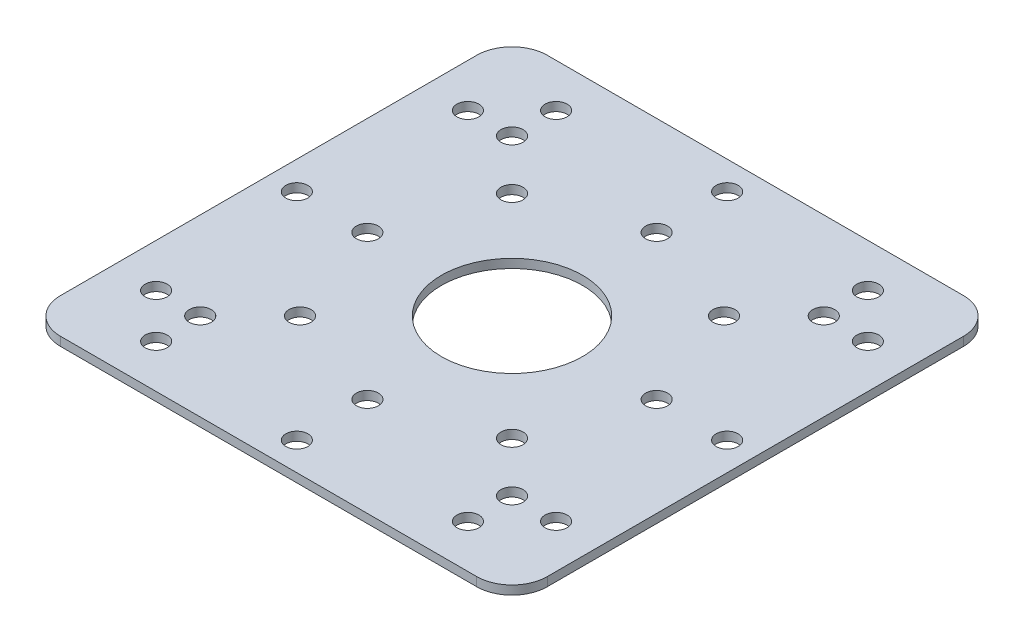
ISO-10303-21;
HEADER;
FILE_DESCRIPTION(('STEP AP214'),'2;1');
FILE_NAME('part.step','',(''),(''),'','','');
FILE_SCHEMA(('AUTOMOTIVE_DESIGN { 1 0 10303 214 1 1 1 1 }'));
ENDSEC;
DATA;
#1=APPLICATION_CONTEXT('core data for automotive mechanical design processes');
#2=APPLICATION_PROTOCOL_DEFINITION('international standard','automotive_design',2000,#1);
#3=PRODUCT_CONTEXT('',#1,'mechanical');
#4=PRODUCT('Part','Part','',(#3));
#5=PRODUCT_RELATED_PRODUCT_CATEGORY('part','',(#4));
#6=PRODUCT_DEFINITION_FORMATION('','',#4);
#7=PRODUCT_DEFINITION_CONTEXT('part definition',#1,'design');
#8=PRODUCT_DEFINITION('design','',#6,#7);
#9=PRODUCT_DEFINITION_SHAPE('','',#8);
#10=(LENGTH_UNIT() NAMED_UNIT(*) SI_UNIT(.MILLI.,.METRE.));
#11=(NAMED_UNIT(*) PLANE_ANGLE_UNIT() SI_UNIT($,.RADIAN.));
#12=(NAMED_UNIT(*) SI_UNIT($,.STERADIAN.) SOLID_ANGLE_UNIT());
#13=UNCERTAINTY_MEASURE_WITH_UNIT(LENGTH_MEASURE(1.E-05),#10,'distance_accuracy_value','');
#14=(GEOMETRIC_REPRESENTATION_CONTEXT(3) GLOBAL_UNCERTAINTY_ASSIGNED_CONTEXT((#13)) GLOBAL_UNIT_ASSIGNED_CONTEXT((#10,
#11,#12)) REPRESENTATION_CONTEXT('',''));
#15=CARTESIAN_POINT('',(0.,0.,0.));
#16=DIRECTION('',(0.,0.,1.));
#17=DIRECTION('',(1.,0.,0.));
#18=AXIS2_PLACEMENT_3D('',#15,#16,#17);
#19=CARTESIAN_POINT('',(-29.972,1.27,29.972));
#20=DIRECTION('',(0.,-1.,0.));
#21=DIRECTION('',(0.,0.,-1.));
#22=AXIS2_PLACEMENT_3D('',#19,#20,#21);
#23=CYLINDRICAL_SURFACE('',#22,5.08);
#24=CARTESIAN_POINT('',(-29.972,0.,29.972));
#25=DIRECTION('',(0.,1.,0.));
#26=DIRECTION('',(0.,0.,1.));
#27=AXIS2_PLACEMENT_3D('',#24,#25,#26);
#28=CIRCLE('',#27,5.08);
#29=CARTESIAN_POINT('',(-35.052,0.,29.972));
#30=VERTEX_POINT('',#29);
#31=CARTESIAN_POINT('',(-29.972,0.,35.052));
#32=VERTEX_POINT('',#31);
#33=EDGE_CURVE('E129',#30,#32,#28,.T.);
#34=ORIENTED_EDGE('',*,*,#33,.T.);
#35=DIRECTION('',(0.,-1.,0.));
#36=VECTOR('',#35,1.);
#37=CARTESIAN_POINT('',(-29.972,1.27,35.052));
#38=LINE('',#37,#36);
#39=CARTESIAN_POINT('',(-29.972,1.27,35.052));
#40=VERTEX_POINT('',#39);
#41=EDGE_CURVE('E11',#40,#32,#38,.T.);
#42=ORIENTED_EDGE('',*,*,#41,.F.);
#43=CARTESIAN_POINT('',(-29.972,1.27,29.972));
#44=DIRECTION('',(0.,1.,0.));
#45=DIRECTION('',(0.,0.,1.));
#46=AXIS2_PLACEMENT_3D('',#43,#44,#45);
#47=CIRCLE('',#46,5.08);
#48=CARTESIAN_POINT('',(-35.052,1.27,29.972));
#49=VERTEX_POINT('',#48);
#50=EDGE_CURVE('E144',#49,#40,#47,.T.);
#51=ORIENTED_EDGE('',*,*,#50,.F.);
#52=DIRECTION('',(0.,-1.,0.));
#53=VECTOR('',#52,1.);
#54=CARTESIAN_POINT('',(-35.052,1.27,29.972));
#55=LINE('',#54,#53);
#56=EDGE_CURVE('E125',#49,#30,#55,.T.);
#57=ORIENTED_EDGE('',*,*,#56,.T.);
#58=EDGE_LOOP('',(#34,#42,#51,#57));
#59=FACE_BOUND('',#58,.T.);
#60=ADVANCED_FACE('F33',(#59),#23,.T.);
#61=CARTESIAN_POINT('',(29.972,1.27,35.052));
#62=DIRECTION('',(0.,0.,-1.));
#63=DIRECTION('',(-1.,0.,0.));
#64=AXIS2_PLACEMENT_3D('',#61,#62,#63);
#65=PLANE('',#64);
#66=DIRECTION('',(1.,0.,0.));
#67=VECTOR('',#66,1.);
#68=CARTESIAN_POINT('',(29.972,0.,35.052));
#69=LINE('',#68,#67);
#70=CARTESIAN_POINT('',(29.972,0.,35.052));
#71=VERTEX_POINT('',#70);
#72=EDGE_CURVE('E132',#32,#71,#69,.T.);
#73=ORIENTED_EDGE('',*,*,#72,.T.);
#74=DIRECTION('',(0.,-1.,0.));
#75=VECTOR('',#74,1.);
#76=CARTESIAN_POINT('',(29.972,1.27,35.052));
#77=LINE('',#76,#75);
#78=CARTESIAN_POINT('',(29.972,1.27,35.052));
#79=VERTEX_POINT('',#78);
#80=EDGE_CURVE('E41',#79,#71,#77,.T.);
#81=ORIENTED_EDGE('',*,*,#80,.F.);
#82=DIRECTION('',(1.,0.,0.));
#83=VECTOR('',#82,1.);
#84=CARTESIAN_POINT('',(29.972,1.27,35.052));
#85=LINE('',#84,#83);
#86=EDGE_CURVE('E92',#40,#79,#85,.T.);
#87=ORIENTED_EDGE('',*,*,#86,.F.);
#88=ORIENTED_EDGE('',*,*,#41,.T.);
#89=EDGE_LOOP('',(#73,#81,#87,#88));
#90=FACE_BOUND('',#89,.T.);
#91=ADVANCED_FACE('F403',(#90),#65,.F.);
#92=CARTESIAN_POINT('',(29.972,1.27,29.972));
#93=DIRECTION('',(0.,-1.,0.));
#94=DIRECTION('',(0.,0.,-1.));
#95=AXIS2_PLACEMENT_3D('',#92,#93,#94);
#96=CYLINDRICAL_SURFACE('',#95,5.08);
#97=CARTESIAN_POINT('',(29.972,0.,29.972));
#98=DIRECTION('',(0.,1.,0.));
#99=DIRECTION('',(0.,0.,1.));
#100=AXIS2_PLACEMENT_3D('',#97,#98,#99);
#101=CIRCLE('',#100,5.08);
#102=CARTESIAN_POINT('',(35.052,0.,29.972));
#103=VERTEX_POINT('',#102);
#104=EDGE_CURVE('E135',#71,#103,#101,.T.);
#105=ORIENTED_EDGE('',*,*,#104,.T.);
#106=DIRECTION('',(0.,-1.,0.));
#107=VECTOR('',#106,1.);
#108=CARTESIAN_POINT('',(35.052,1.27,29.972));
#109=LINE('',#108,#107);
#110=CARTESIAN_POINT('',(35.052,1.27,29.972));
#111=VERTEX_POINT('',#110);
#112=EDGE_CURVE('E151',#111,#103,#109,.T.);
#113=ORIENTED_EDGE('',*,*,#112,.F.);
#114=CARTESIAN_POINT('',(29.972,1.27,29.972));
#115=DIRECTION('',(0.,1.,0.));
#116=DIRECTION('',(0.,0.,1.));
#117=AXIS2_PLACEMENT_3D('',#114,#115,#116);
#118=CIRCLE('',#117,5.08);
#119=EDGE_CURVE('E159',#79,#111,#118,.T.);
#120=ORIENTED_EDGE('',*,*,#119,.F.);
#121=ORIENTED_EDGE('',*,*,#80,.T.);
#122=EDGE_LOOP('',(#105,#113,#120,#121));
#123=FACE_BOUND('',#122,.T.);
#124=ADVANCED_FACE('F157',(#123),#96,.T.);
#125=CARTESIAN_POINT('',(35.052,1.27,29.972));
#126=DIRECTION('',(-1.,0.,0.));
#127=DIRECTION('',(0.,0.,1.));
#128=AXIS2_PLACEMENT_3D('',#125,#126,#127);
#129=PLANE('',#128);
#130=DIRECTION('',(0.,0.,-1.));
#131=VECTOR('',#130,1.);
#132=CARTESIAN_POINT('',(35.052,0.,29.972));
#133=LINE('',#132,#131);
#134=CARTESIAN_POINT('',(35.052,0.,-29.972));
#135=VERTEX_POINT('',#134);
#136=EDGE_CURVE('E137',#103,#135,#133,.T.);
#137=ORIENTED_EDGE('',*,*,#136,.T.);
#138=DIRECTION('',(0.,-1.,0.));
#139=VECTOR('',#138,1.);
#140=CARTESIAN_POINT('',(35.052,1.27,-29.972));
#141=LINE('',#140,#139);
#142=CARTESIAN_POINT('',(35.052,1.27,-29.972));
#143=VERTEX_POINT('',#142);
#144=EDGE_CURVE('E148',#143,#135,#141,.T.);
#145=ORIENTED_EDGE('',*,*,#144,.F.);
#146=DIRECTION('',(0.,0.,-1.));
#147=VECTOR('',#146,1.);
#148=CARTESIAN_POINT('',(35.052,1.27,29.972));
#149=LINE('',#148,#147);
#150=EDGE_CURVE('E171',#111,#143,#149,.T.);
#151=ORIENTED_EDGE('',*,*,#150,.F.);
#152=ORIENTED_EDGE('',*,*,#112,.T.);
#153=EDGE_LOOP('',(#137,#145,#151,#152));
#154=FACE_BOUND('',#153,.T.);
#155=ADVANCED_FACE('F167',(#154),#129,.F.);
#156=CARTESIAN_POINT('',(29.972,1.27,-29.972));
#157=DIRECTION('',(0.,-1.,0.));
#158=DIRECTION('',(0.,0.,-1.));
#159=AXIS2_PLACEMENT_3D('',#156,#157,#158);
#160=CYLINDRICAL_SURFACE('',#159,5.08);
#161=CARTESIAN_POINT('',(29.972,0.,-29.972));
#162=DIRECTION('',(0.,1.,0.));
#163=DIRECTION('',(0.,0.,1.));
#164=AXIS2_PLACEMENT_3D('',#161,#162,#163);
#165=CIRCLE('',#164,5.08);
#166=CARTESIAN_POINT('',(29.972,0.,-35.052));
#167=VERTEX_POINT('',#166);
#168=EDGE_CURVE('E139',#135,#167,#165,.T.);
#169=ORIENTED_EDGE('',*,*,#168,.T.);
#170=DIRECTION('',(0.,-1.,0.));
#171=VECTOR('',#170,1.);
#172=CARTESIAN_POINT('',(29.972,1.27,-35.052));
#173=LINE('',#172,#171);
#174=CARTESIAN_POINT('',(29.972,1.27,-35.052));
#175=VERTEX_POINT('',#174);
#176=EDGE_CURVE('E120',#175,#167,#173,.T.);
#177=ORIENTED_EDGE('',*,*,#176,.F.);
#178=CARTESIAN_POINT('',(29.972,1.27,-29.972));
#179=DIRECTION('',(0.,1.,0.));
#180=DIRECTION('',(0.,0.,1.));
#181=AXIS2_PLACEMENT_3D('',#178,#179,#180);
#182=CIRCLE('',#181,5.08);
#183=EDGE_CURVE('E111',#143,#175,#182,.T.);
#184=ORIENTED_EDGE('',*,*,#183,.F.);
#185=ORIENTED_EDGE('',*,*,#144,.T.);
#186=EDGE_LOOP('',(#169,#177,#184,#185));
#187=FACE_BOUND('',#186,.T.);
#188=ADVANCED_FACE('F170',(#187),#160,.T.);
#189=CARTESIAN_POINT('',(29.972,1.27,-35.052));
#190=DIRECTION('',(0.,0.,1.));
#191=DIRECTION('',(1.,0.,0.));
#192=AXIS2_PLACEMENT_3D('',#189,#190,#191);
#193=PLANE('',#192);
#194=DIRECTION('',(-1.,0.,0.));
#195=VECTOR('',#194,1.);
#196=CARTESIAN_POINT('',(29.972,0.,-35.052));
#197=LINE('',#196,#195);
#198=CARTESIAN_POINT('',(-29.972,0.,-35.052));
#199=VERTEX_POINT('',#198);
#200=EDGE_CURVE('E119',#167,#199,#197,.T.);
#201=ORIENTED_EDGE('',*,*,#200,.T.);
#202=DIRECTION('',(0.,-1.,0.));
#203=VECTOR('',#202,1.);
#204=CARTESIAN_POINT('',(-29.972,1.27,-35.052));
#205=LINE('',#204,#203);
#206=CARTESIAN_POINT('',(-29.972,1.27,-35.052));
#207=VERTEX_POINT('',#206);
#208=EDGE_CURVE('E116',#207,#199,#205,.T.);
#209=ORIENTED_EDGE('',*,*,#208,.F.);
#210=DIRECTION('',(-1.,0.,0.));
#211=VECTOR('',#210,1.);
#212=CARTESIAN_POINT('',(29.972,1.27,-35.052));
#213=LINE('',#212,#211);
#214=EDGE_CURVE('E105',#175,#207,#213,.T.);
#215=ORIENTED_EDGE('',*,*,#214,.F.);
#216=ORIENTED_EDGE('',*,*,#176,.T.);
#217=EDGE_LOOP('',(#201,#209,#215,#216));
#218=FACE_BOUND('',#217,.T.);
#219=ADVANCED_FACE('F117',(#218),#193,.F.);
#220=CARTESIAN_POINT('',(-29.972,1.27,-29.972));
#221=DIRECTION('',(0.,-1.,0.));
#222=DIRECTION('',(0.,0.,-1.));
#223=AXIS2_PLACEMENT_3D('',#220,#221,#222);
#224=CYLINDRICAL_SURFACE('',#223,5.08);
#225=CARTESIAN_POINT('',(-29.972,0.,-29.972));
#226=DIRECTION('',(0.,1.,0.));
#227=DIRECTION('',(0.,0.,1.));
#228=AXIS2_PLACEMENT_3D('',#225,#226,#227);
#229=CIRCLE('',#228,5.08);
#230=CARTESIAN_POINT('',(-35.052,0.,-29.972));
#231=VERTEX_POINT('',#230);
#232=EDGE_CURVE('E78',#199,#231,#229,.T.);
#233=ORIENTED_EDGE('',*,*,#232,.T.);
#234=DIRECTION('',(0.,-1.,0.));
#235=VECTOR('',#234,1.);
#236=CARTESIAN_POINT('',(-35.052,1.27,-29.972));
#237=LINE('',#236,#235);
#238=CARTESIAN_POINT('',(-35.052,1.27,-29.972));
#239=VERTEX_POINT('',#238);
#240=EDGE_CURVE('E121',#239,#231,#237,.T.);
#241=ORIENTED_EDGE('',*,*,#240,.F.);
#242=CARTESIAN_POINT('',(-29.972,1.27,-29.972));
#243=DIRECTION('',(0.,1.,0.));
#244=DIRECTION('',(0.,0.,1.));
#245=AXIS2_PLACEMENT_3D('',#242,#243,#244);
#246=CIRCLE('',#245,5.08);
#247=EDGE_CURVE('E109',#207,#239,#246,.T.);
#248=ORIENTED_EDGE('',*,*,#247,.F.);
#249=ORIENTED_EDGE('',*,*,#208,.T.);
#250=EDGE_LOOP('',(#233,#241,#248,#249));
#251=FACE_BOUND('',#250,.T.);
#252=ADVANCED_FACE('F123',(#251),#224,.T.);
#253=CARTESIAN_POINT('',(-35.052,1.27,29.972));
#254=DIRECTION('',(1.,0.,0.));
#255=DIRECTION('',(0.,0.,-1.));
#256=AXIS2_PLACEMENT_3D('',#253,#254,#255);
#257=PLANE('',#256);
#258=DIRECTION('',(0.,0.,1.));
#259=VECTOR('',#258,1.);
#260=CARTESIAN_POINT('',(-35.052,0.,29.972));
#261=LINE('',#260,#259);
#262=EDGE_CURVE('E84',#231,#30,#261,.T.);
#263=ORIENTED_EDGE('',*,*,#262,.T.);
#264=ORIENTED_EDGE('',*,*,#56,.F.);
#265=DIRECTION('',(0.,0.,1.));
#266=VECTOR('',#265,1.);
#267=CARTESIAN_POINT('',(-35.052,1.27,29.972));
#268=LINE('',#267,#266);
#269=EDGE_CURVE('E49',#239,#49,#268,.T.);
#270=ORIENTED_EDGE('',*,*,#269,.F.);
#271=ORIENTED_EDGE('',*,*,#240,.T.);
#272=EDGE_LOOP('',(#263,#264,#270,#271));
#273=FACE_BOUND('',#272,.T.);
#274=ADVANCED_FACE('F338',(#273),#257,.F.);
#275=CARTESIAN_POINT('',(-29.972,1.27,29.972));
#276=DIRECTION('',(0.,1.,0.));
#277=DIRECTION('',(0.,0.,1.));
#278=AXIS2_PLACEMENT_3D('',#275,#276,#277);
#279=PLANE('',#278);
#280=CARTESIAN_POINT('',(-22.4506403026729,1.27,-22.4506403026729));
#281=DIRECTION('',(0.,1.,0.));
#282=DIRECTION('',(0.,0.,-1.));
#283=AXIS2_PLACEMENT_3D('',#280,#281,#282);
#284=CIRCLE('',#283,1.5875);
#285=CARTESIAN_POINT('',(-22.4506403026729,1.27,-24.0381403026729));
#286=VERTEX_POINT('',#285);
#287=EDGE_CURVE('E321',#286,#286,#284,.T.);
#288=ORIENTED_EDGE('',*,*,#287,.F.);
#289=EDGE_LOOP('',(#288));
#290=FACE_BOUND('',#289,.T.);
#291=CARTESIAN_POINT('',(-15.2664354058176,1.27,-15.2664354058176));
#292=DIRECTION('',(0.,1.,0.));
#293=DIRECTION('',(0.,0.,-1.));
#294=AXIS2_PLACEMENT_3D('',#291,#292,#293);
#295=CIRCLE('',#294,1.5875);
#296=CARTESIAN_POINT('',(-15.2664354058176,1.27,-16.8539354058176));
#297=VERTEX_POINT('',#296);
#298=EDGE_CURVE('E315',#297,#297,#295,.T.);
#299=ORIENTED_EDGE('',*,*,#298,.F.);
#300=EDGE_LOOP('',(#299));
#301=FACE_BOUND('',#300,.T.);
#302=CARTESIAN_POINT('',(-28.8006403026729,1.27,-22.4506403026729));
#303=DIRECTION('',(0.,1.,0.));
#304=DIRECTION('',(0.,0.,-1.));
#305=AXIS2_PLACEMENT_3D('',#302,#303,#304);
#306=CIRCLE('',#305,1.5875);
#307=CARTESIAN_POINT('',(-28.8006403026729,1.27,-24.0381403026729));
#308=VERTEX_POINT('',#307);
#309=EDGE_CURVE('E309',#308,#308,#306,.T.);
#310=ORIENTED_EDGE('',*,*,#309,.F.);
#311=EDGE_LOOP('',(#310));
#312=FACE_BOUND('',#311,.T.);
#313=CARTESIAN_POINT('',(-22.4506403026729,1.27,-28.8006403026729));
#314=DIRECTION('',(0.,1.,0.));
#315=DIRECTION('',(0.,0.,-1.));
#316=AXIS2_PLACEMENT_3D('',#313,#314,#315);
#317=CIRCLE('',#316,1.5875);
#318=CARTESIAN_POINT('',(-22.4506403026729,1.27,-30.3881403026729));
#319=VERTEX_POINT('',#318);
#320=EDGE_CURVE('E303',#319,#319,#317,.T.);
#321=ORIENTED_EDGE('',*,*,#320,.F.);
#322=EDGE_LOOP('',(#321));
#323=FACE_BOUND('',#322,.T.);
#324=CARTESIAN_POINT('',(15.2664354058175,1.27,-15.2664354058176));
#325=DIRECTION('',(0.,1.,0.));
#326=DIRECTION('',(0.,0.,1.));
#327=AXIS2_PLACEMENT_3D('',#324,#325,#326);
#328=CIRCLE('',#327,1.5875);
#329=CARTESIAN_POINT('',(15.2664354058175,1.27,-13.6789354058176));
#330=VERTEX_POINT('',#329);
#331=EDGE_CURVE('E297',#330,#330,#328,.T.);
#332=ORIENTED_EDGE('',*,*,#331,.F.);
#333=EDGE_LOOP('',(#332));
#334=FACE_BOUND('',#333,.T.);
#335=CARTESIAN_POINT('',(22.4506403026729,1.27,-22.4506403026729));
#336=DIRECTION('',(0.,1.,0.));
#337=DIRECTION('',(0.,0.,1.));
#338=AXIS2_PLACEMENT_3D('',#335,#336,#337);
#339=CIRCLE('',#338,1.5875);
#340=CARTESIAN_POINT('',(22.4506403026729,1.27,-20.8631403026729));
#341=VERTEX_POINT('',#340);
#342=EDGE_CURVE('E291',#341,#341,#339,.T.);
#343=ORIENTED_EDGE('',*,*,#342,.F.);
#344=EDGE_LOOP('',(#343));
#345=FACE_BOUND('',#344,.T.);
#346=CARTESIAN_POINT('',(22.4506403026729,1.27,-28.8006403026729));
#347=DIRECTION('',(0.,1.,0.));
#348=DIRECTION('',(0.,0.,1.));
#349=AXIS2_PLACEMENT_3D('',#346,#347,#348);
#350=CIRCLE('',#349,1.5875);
#351=CARTESIAN_POINT('',(22.4506403026729,1.27,-27.2131403026729));
#352=VERTEX_POINT('',#351);
#353=EDGE_CURVE('E285',#352,#352,#350,.T.);
#354=ORIENTED_EDGE('',*,*,#353,.F.);
#355=EDGE_LOOP('',(#354));
#356=FACE_BOUND('',#355,.T.);
#357=CARTESIAN_POINT('',(28.8006403026729,1.27,-22.4506403026729));
#358=DIRECTION('',(0.,1.,0.));
#359=DIRECTION('',(0.,0.,1.));
#360=AXIS2_PLACEMENT_3D('',#357,#358,#359);
#361=CIRCLE('',#360,1.5875);
#362=CARTESIAN_POINT('',(28.8006403026729,1.27,-20.8631403026729));
#363=VERTEX_POINT('',#362);
#364=EDGE_CURVE('E279',#363,#363,#361,.T.);
#365=ORIENTED_EDGE('',*,*,#364,.F.);
#366=EDGE_LOOP('',(#365));
#367=FACE_BOUND('',#366,.T.);
#368=CARTESIAN_POINT('',(15.2664354058175,1.27,15.2664354058176));
#369=DIRECTION('',(0.,1.,0.));
#370=DIRECTION('',(0.,0.,-1.));
#371=AXIS2_PLACEMENT_3D('',#368,#369,#370);
#372=CIRCLE('',#371,1.5875);
#373=CARTESIAN_POINT('',(15.2664354058175,1.27,13.6789354058176));
#374=VERTEX_POINT('',#373);
#375=EDGE_CURVE('E273',#374,#374,#372,.T.);
#376=ORIENTED_EDGE('',*,*,#375,.F.);
#377=EDGE_LOOP('',(#376));
#378=FACE_BOUND('',#377,.T.);
#379=CARTESIAN_POINT('',(22.4506403026729,1.27,22.4506403026729));
#380=DIRECTION('',(0.,1.,0.));
#381=DIRECTION('',(0.,0.,-1.));
#382=AXIS2_PLACEMENT_3D('',#379,#380,#381);
#383=CIRCLE('',#382,1.5875);
#384=CARTESIAN_POINT('',(22.4506403026729,1.27,20.8631403026729));
#385=VERTEX_POINT('',#384);
#386=EDGE_CURVE('E267',#385,#385,#383,.T.);
#387=ORIENTED_EDGE('',*,*,#386,.F.);
#388=EDGE_LOOP('',(#387));
#389=FACE_BOUND('',#388,.T.);
#390=CARTESIAN_POINT('',(22.4506403026729,1.27,28.8006403026729));
#391=DIRECTION('',(0.,1.,0.));
#392=DIRECTION('',(0.,0.,-1.));
#393=AXIS2_PLACEMENT_3D('',#390,#391,#392);
#394=CIRCLE('',#393,1.5875);
#395=CARTESIAN_POINT('',(22.4506403026729,1.27,27.2131403026729));
#396=VERTEX_POINT('',#395);
#397=EDGE_CURVE('E261',#396,#396,#394,.T.);
#398=ORIENTED_EDGE('',*,*,#397,.F.);
#399=EDGE_LOOP('',(#398));
#400=FACE_BOUND('',#399,.T.);
#401=CARTESIAN_POINT('',(28.8006403026729,1.27,22.4506403026729));
#402=DIRECTION('',(0.,1.,0.));
#403=DIRECTION('',(0.,0.,-1.));
#404=AXIS2_PLACEMENT_3D('',#401,#402,#403);
#405=CIRCLE('',#404,1.5875);
#406=CARTESIAN_POINT('',(28.8006403026729,1.27,20.8631403026729));
#407=VERTEX_POINT('',#406);
#408=EDGE_CURVE('E255',#407,#407,#405,.T.);
#409=ORIENTED_EDGE('',*,*,#408,.F.);
#410=EDGE_LOOP('',(#409));
#411=FACE_BOUND('',#410,.T.);
#412=CARTESIAN_POINT('',(-22.4506403026729,1.27,28.8006403026729));
#413=DIRECTION('',(0.,1.,0.));
#414=DIRECTION('',(0.,0.,1.));
#415=AXIS2_PLACEMENT_3D('',#412,#413,#414);
#416=CIRCLE('',#415,1.5875);
#417=CARTESIAN_POINT('',(-22.4506403026729,1.27,30.3881403026729));
#418=VERTEX_POINT('',#417);
#419=EDGE_CURVE('E249',#418,#418,#416,.T.);
#420=ORIENTED_EDGE('',*,*,#419,.F.);
#421=EDGE_LOOP('',(#420));
#422=FACE_BOUND('',#421,.T.);
#423=CARTESIAN_POINT('',(-28.8006403026729,1.27,22.4506403026729));
#424=DIRECTION('',(0.,1.,0.));
#425=DIRECTION('',(0.,0.,1.));
#426=AXIS2_PLACEMENT_3D('',#423,#424,#425);
#427=CIRCLE('',#426,1.5875);
#428=CARTESIAN_POINT('',(-28.8006403026729,1.27,24.0381403026729));
#429=VERTEX_POINT('',#428);
#430=EDGE_CURVE('E243',#429,#429,#427,.T.);
#431=ORIENTED_EDGE('',*,*,#430,.F.);
#432=EDGE_LOOP('',(#431));
#433=FACE_BOUND('',#432,.T.);
#434=CARTESIAN_POINT('',(-22.4506403026729,1.27,22.4506403026729));
#435=DIRECTION('',(0.,1.,0.));
#436=DIRECTION('',(0.,0.,1.));
#437=AXIS2_PLACEMENT_3D('',#434,#435,#436);
#438=CIRCLE('',#437,1.5875);
#439=CARTESIAN_POINT('',(-22.4506403026729,1.27,24.0381403026729));
#440=VERTEX_POINT('',#439);
#441=EDGE_CURVE('E237',#440,#440,#438,.T.);
#442=ORIENTED_EDGE('',*,*,#441,.F.);
#443=EDGE_LOOP('',(#442));
#444=FACE_BOUND('',#443,.T.);
#445=CARTESIAN_POINT('',(-15.2664354058176,1.27,15.2664354058176));
#446=DIRECTION('',(0.,1.,0.));
#447=DIRECTION('',(0.,0.,1.));
#448=AXIS2_PLACEMENT_3D('',#445,#446,#447);
#449=CIRCLE('',#448,1.5875);
#450=CARTESIAN_POINT('',(-15.2664354058176,1.27,16.8539354058176));
#451=VERTEX_POINT('',#450);
#452=EDGE_CURVE('E231',#451,#451,#449,.T.);
#453=ORIENTED_EDGE('',*,*,#452,.F.);
#454=EDGE_LOOP('',(#453));
#455=FACE_BOUND('',#454,.T.);
#456=CARTESIAN_POINT('',(0.,1.27,-20.828));
#457=DIRECTION('',(0.,1.,0.));
#458=DIRECTION('',(0.,0.,-1.));
#459=AXIS2_PLACEMENT_3D('',#456,#457,#458);
#460=CIRCLE('',#459,1.5875);
#461=CARTESIAN_POINT('',(0.,1.27,-22.4155));
#462=VERTEX_POINT('',#461);
#463=EDGE_CURVE('E225',#462,#462,#460,.T.);
#464=ORIENTED_EDGE('',*,*,#463,.F.);
#465=EDGE_LOOP('',(#464));
#466=FACE_BOUND('',#465,.T.);
#467=CARTESIAN_POINT('',(6.07938570672835E-13,1.27,-30.988));
#468=DIRECTION('',(0.,1.,0.));
#469=DIRECTION('',(0.,0.,-1.));
#470=AXIS2_PLACEMENT_3D('',#467,#468,#469);
#471=CIRCLE('',#470,1.5875);
#472=CARTESIAN_POINT('',(6.07938570672835E-13,1.27,-32.5755));
#473=VERTEX_POINT('',#472);
#474=EDGE_CURVE('E219',#473,#473,#471,.T.);
#475=ORIENTED_EDGE('',*,*,#474,.F.);
#476=EDGE_LOOP('',(#475));
#477=FACE_BOUND('',#476,.T.);
#478=CARTESIAN_POINT('',(-30.988,1.27,0.));
#479=DIRECTION('',(0.,1.,0.));
#480=DIRECTION('',(0.,0.,-1.));
#481=AXIS2_PLACEMENT_3D('',#478,#479,#480);
#482=CIRCLE('',#481,1.5875);
#483=CARTESIAN_POINT('',(-30.988,1.27,-1.58750000000002));
#484=VERTEX_POINT('',#483);
#485=EDGE_CURVE('E213',#484,#484,#482,.T.);
#486=ORIENTED_EDGE('',*,*,#485,.F.);
#487=EDGE_LOOP('',(#486));
#488=FACE_BOUND('',#487,.T.);
#489=CARTESIAN_POINT('',(-20.8337921886678,1.27,0.));
#490=DIRECTION('',(0.,1.,0.));
#491=DIRECTION('',(0.,0.,-1.));
#492=AXIS2_PLACEMENT_3D('',#489,#490,#491);
#493=CIRCLE('',#492,1.5875);
#494=CARTESIAN_POINT('',(-20.8337921886678,1.27,-1.58750000000002));
#495=VERTEX_POINT('',#494);
#496=EDGE_CURVE('E207',#495,#495,#493,.T.);
#497=ORIENTED_EDGE('',*,*,#496,.F.);
#498=EDGE_LOOP('',(#497));
#499=FACE_BOUND('',#498,.T.);
#500=CARTESIAN_POINT('',(5.65519853168439E-13,1.27,30.988));
#501=DIRECTION('',(0.,1.,0.));
#502=DIRECTION('',(0.,0.,1.));
#503=AXIS2_PLACEMENT_3D('',#500,#501,#502);
#504=CIRCLE('',#503,1.5875);
#505=CARTESIAN_POINT('',(5.65519853168439E-13,1.27,32.5755));
#506=VERTEX_POINT('',#505);
#507=EDGE_CURVE('E201',#506,#506,#504,.T.);
#508=ORIENTED_EDGE('',*,*,#507,.F.);
#509=EDGE_LOOP('',(#508));
#510=FACE_BOUND('',#509,.T.);
#511=CARTESIAN_POINT('',(30.988,1.27,0.));
#512=DIRECTION('',(0.,1.,0.));
#513=DIRECTION('',(0.,0.,1.));
#514=AXIS2_PLACEMENT_3D('',#511,#512,#513);
#515=CIRCLE('',#514,1.5875);
#516=CARTESIAN_POINT('',(30.988,1.27,1.5875));
#517=VERTEX_POINT('',#516);
#518=EDGE_CURVE('E195',#517,#517,#515,.T.);
#519=ORIENTED_EDGE('',*,*,#518,.F.);
#520=EDGE_LOOP('',(#519));
#521=FACE_BOUND('',#520,.T.);
#522=CARTESIAN_POINT('',(0.,1.27,20.828));
#523=DIRECTION('',(0.,1.,0.));
#524=DIRECTION('',(0.,0.,1.));
#525=AXIS2_PLACEMENT_3D('',#522,#523,#524);
#526=CIRCLE('',#525,1.5875);
#527=CARTESIAN_POINT('',(0.,1.27,22.4155));
#528=VERTEX_POINT('',#527);
#529=EDGE_CURVE('E189',#528,#528,#526,.T.);
#530=ORIENTED_EDGE('',*,*,#529,.F.);
#531=EDGE_LOOP('',(#530));
#532=FACE_BOUND('',#531,.T.);
#533=CARTESIAN_POINT('',(20.8337921886678,1.27,0.));
#534=DIRECTION('',(0.,1.,0.));
#535=DIRECTION('',(0.,0.,1.));
#536=AXIS2_PLACEMENT_3D('',#533,#534,#535);
#537=CIRCLE('',#536,1.5875);
#538=CARTESIAN_POINT('',(20.8337921886678,1.27,1.5875));
#539=VERTEX_POINT('',#538);
#540=EDGE_CURVE('E183',#539,#539,#537,.T.);
#541=ORIENTED_EDGE('',*,*,#540,.F.);
#542=EDGE_LOOP('',(#541));
#543=FACE_BOUND('',#542,.T.);
#544=CARTESIAN_POINT('',(0.,1.27,0.));
#545=DIRECTION('',(0.,1.,0.));
#546=DIRECTION('',(0.,0.,1.));
#547=AXIS2_PLACEMENT_3D('',#544,#545,#546);
#548=CIRCLE('',#547,10.16);
#549=CARTESIAN_POINT('',(0.,1.27,10.16));
#550=VERTEX_POINT('',#549);
#551=EDGE_CURVE('E177',#550,#550,#548,.T.);
#552=ORIENTED_EDGE('',*,*,#551,.F.);
#553=EDGE_LOOP('',(#552));
#554=FACE_BOUND('',#553,.T.);
#555=ORIENTED_EDGE('',*,*,#50,.T.);
#556=ORIENTED_EDGE('',*,*,#86,.T.);
#557=ORIENTED_EDGE('',*,*,#119,.T.);
#558=ORIENTED_EDGE('',*,*,#150,.T.);
#559=ORIENTED_EDGE('',*,*,#183,.T.);
#560=ORIENTED_EDGE('',*,*,#214,.T.);
#561=ORIENTED_EDGE('',*,*,#247,.T.);
#562=ORIENTED_EDGE('',*,*,#269,.T.);
#563=EDGE_LOOP('',(#555,#556,#557,#558,#559,#560,#561,#562));
#564=FACE_BOUND('',#563,.T.);
#565=ADVANCED_FACE('F107',(#290,#301,#312,#323,#334,#345,#356,#367,#378,#389,#400,#411,#422,
#433,#444,#455,#466,#477,#488,#499,#510,#521,#532,#543,#554,#564),#279,.T.);
#566=CARTESIAN_POINT('',(-29.972,0.,29.972));
#567=DIRECTION('',(0.,1.,0.));
#568=DIRECTION('',(0.,0.,1.));
#569=AXIS2_PLACEMENT_3D('',#566,#567,#568);
#570=PLANE('',#569);
#571=CARTESIAN_POINT('',(-22.4506403026729,0.,-22.4506403026729));
#572=DIRECTION('',(0.,1.,0.));
#573=DIRECTION('',(0.,0.,-1.));
#574=AXIS2_PLACEMENT_3D('',#571,#572,#573);
#575=CIRCLE('',#574,1.5875);
#576=CARTESIAN_POINT('',(-22.4506403026729,0.,-24.0381403026729));
#577=VERTEX_POINT('',#576);
#578=EDGE_CURVE('E318',#577,#577,#575,.T.);
#579=ORIENTED_EDGE('',*,*,#578,.T.);
#580=EDGE_LOOP('',(#579));
#581=FACE_BOUND('',#580,.T.);
#582=CARTESIAN_POINT('',(-15.2664354058176,0.,-15.2664354058176));
#583=DIRECTION('',(0.,1.,0.));
#584=DIRECTION('',(0.,0.,-1.));
#585=AXIS2_PLACEMENT_3D('',#582,#583,#584);
#586=CIRCLE('',#585,1.5875);
#587=CARTESIAN_POINT('',(-15.2664354058176,0.,-16.8539354058176));
#588=VERTEX_POINT('',#587);
#589=EDGE_CURVE('E312',#588,#588,#586,.T.);
#590=ORIENTED_EDGE('',*,*,#589,.T.);
#591=EDGE_LOOP('',(#590));
#592=FACE_BOUND('',#591,.T.);
#593=CARTESIAN_POINT('',(-28.8006403026729,0.,-22.4506403026729));
#594=DIRECTION('',(0.,1.,0.));
#595=DIRECTION('',(0.,0.,-1.));
#596=AXIS2_PLACEMENT_3D('',#593,#594,#595);
#597=CIRCLE('',#596,1.5875);
#598=CARTESIAN_POINT('',(-28.8006403026729,0.,-24.0381403026729));
#599=VERTEX_POINT('',#598);
#600=EDGE_CURVE('E306',#599,#599,#597,.T.);
#601=ORIENTED_EDGE('',*,*,#600,.T.);
#602=EDGE_LOOP('',(#601));
#603=FACE_BOUND('',#602,.T.);
#604=CARTESIAN_POINT('',(-22.4506403026729,0.,-28.8006403026729));
#605=DIRECTION('',(0.,1.,0.));
#606=DIRECTION('',(0.,0.,-1.));
#607=AXIS2_PLACEMENT_3D('',#604,#605,#606);
#608=CIRCLE('',#607,1.5875);
#609=CARTESIAN_POINT('',(-22.4506403026729,0.,-30.3881403026729));
#610=VERTEX_POINT('',#609);
#611=EDGE_CURVE('E300',#610,#610,#608,.T.);
#612=ORIENTED_EDGE('',*,*,#611,.T.);
#613=EDGE_LOOP('',(#612));
#614=FACE_BOUND('',#613,.T.);
#615=CARTESIAN_POINT('',(15.2664354058175,0.,-15.2664354058176));
#616=DIRECTION('',(0.,1.,0.));
#617=DIRECTION('',(0.,0.,1.));
#618=AXIS2_PLACEMENT_3D('',#615,#616,#617);
#619=CIRCLE('',#618,1.5875);
#620=CARTESIAN_POINT('',(15.2664354058175,0.,-13.6789354058176));
#621=VERTEX_POINT('',#620);
#622=EDGE_CURVE('E294',#621,#621,#619,.T.);
#623=ORIENTED_EDGE('',*,*,#622,.T.);
#624=EDGE_LOOP('',(#623));
#625=FACE_BOUND('',#624,.T.);
#626=CARTESIAN_POINT('',(22.4506403026729,0.,-22.4506403026729));
#627=DIRECTION('',(0.,1.,0.));
#628=DIRECTION('',(0.,0.,1.));
#629=AXIS2_PLACEMENT_3D('',#626,#627,#628);
#630=CIRCLE('',#629,1.5875);
#631=CARTESIAN_POINT('',(22.4506403026729,0.,-20.8631403026729));
#632=VERTEX_POINT('',#631);
#633=EDGE_CURVE('E288',#632,#632,#630,.T.);
#634=ORIENTED_EDGE('',*,*,#633,.T.);
#635=EDGE_LOOP('',(#634));
#636=FACE_BOUND('',#635,.T.);
#637=CARTESIAN_POINT('',(22.4506403026729,0.,-28.8006403026729));
#638=DIRECTION('',(0.,1.,0.));
#639=DIRECTION('',(0.,0.,1.));
#640=AXIS2_PLACEMENT_3D('',#637,#638,#639);
#641=CIRCLE('',#640,1.5875);
#642=CARTESIAN_POINT('',(22.4506403026729,0.,-27.2131403026729));
#643=VERTEX_POINT('',#642);
#644=EDGE_CURVE('E282',#643,#643,#641,.T.);
#645=ORIENTED_EDGE('',*,*,#644,.T.);
#646=EDGE_LOOP('',(#645));
#647=FACE_BOUND('',#646,.T.);
#648=CARTESIAN_POINT('',(28.8006403026729,0.,-22.4506403026729));
#649=DIRECTION('',(0.,1.,0.));
#650=DIRECTION('',(0.,0.,1.));
#651=AXIS2_PLACEMENT_3D('',#648,#649,#650);
#652=CIRCLE('',#651,1.5875);
#653=CARTESIAN_POINT('',(28.8006403026729,0.,-20.8631403026729));
#654=VERTEX_POINT('',#653);
#655=EDGE_CURVE('E276',#654,#654,#652,.T.);
#656=ORIENTED_EDGE('',*,*,#655,.T.);
#657=EDGE_LOOP('',(#656));
#658=FACE_BOUND('',#657,.T.);
#659=CARTESIAN_POINT('',(15.2664354058175,0.,15.2664354058176));
#660=DIRECTION('',(0.,1.,0.));
#661=DIRECTION('',(0.,0.,-1.));
#662=AXIS2_PLACEMENT_3D('',#659,#660,#661);
#663=CIRCLE('',#662,1.5875);
#664=CARTESIAN_POINT('',(15.2664354058175,0.,13.6789354058176));
#665=VERTEX_POINT('',#664);
#666=EDGE_CURVE('E270',#665,#665,#663,.T.);
#667=ORIENTED_EDGE('',*,*,#666,.T.);
#668=EDGE_LOOP('',(#667));
#669=FACE_BOUND('',#668,.T.);
#670=CARTESIAN_POINT('',(22.4506403026729,0.,22.4506403026729));
#671=DIRECTION('',(0.,1.,0.));
#672=DIRECTION('',(0.,0.,-1.));
#673=AXIS2_PLACEMENT_3D('',#670,#671,#672);
#674=CIRCLE('',#673,1.5875);
#675=CARTESIAN_POINT('',(22.4506403026729,0.,20.8631403026729));
#676=VERTEX_POINT('',#675);
#677=EDGE_CURVE('E264',#676,#676,#674,.T.);
#678=ORIENTED_EDGE('',*,*,#677,.T.);
#679=EDGE_LOOP('',(#678));
#680=FACE_BOUND('',#679,.T.);
#681=CARTESIAN_POINT('',(22.4506403026729,0.,28.8006403026729));
#682=DIRECTION('',(0.,1.,0.));
#683=DIRECTION('',(0.,0.,-1.));
#684=AXIS2_PLACEMENT_3D('',#681,#682,#683);
#685=CIRCLE('',#684,1.5875);
#686=CARTESIAN_POINT('',(22.4506403026729,0.,27.2131403026729));
#687=VERTEX_POINT('',#686);
#688=EDGE_CURVE('E258',#687,#687,#685,.T.);
#689=ORIENTED_EDGE('',*,*,#688,.T.);
#690=EDGE_LOOP('',(#689));
#691=FACE_BOUND('',#690,.T.);
#692=CARTESIAN_POINT('',(28.8006403026729,0.,22.4506403026729));
#693=DIRECTION('',(0.,1.,0.));
#694=DIRECTION('',(0.,0.,-1.));
#695=AXIS2_PLACEMENT_3D('',#692,#693,#694);
#696=CIRCLE('',#695,1.5875);
#697=CARTESIAN_POINT('',(28.8006403026729,0.,20.8631403026729));
#698=VERTEX_POINT('',#697);
#699=EDGE_CURVE('E252',#698,#698,#696,.T.);
#700=ORIENTED_EDGE('',*,*,#699,.T.);
#701=EDGE_LOOP('',(#700));
#702=FACE_BOUND('',#701,.T.);
#703=CARTESIAN_POINT('',(-22.4506403026729,0.,28.8006403026729));
#704=DIRECTION('',(0.,1.,0.));
#705=DIRECTION('',(0.,0.,1.));
#706=AXIS2_PLACEMENT_3D('',#703,#704,#705);
#707=CIRCLE('',#706,1.5875);
#708=CARTESIAN_POINT('',(-22.4506403026729,0.,30.3881403026729));
#709=VERTEX_POINT('',#708);
#710=EDGE_CURVE('E246',#709,#709,#707,.T.);
#711=ORIENTED_EDGE('',*,*,#710,.T.);
#712=EDGE_LOOP('',(#711));
#713=FACE_BOUND('',#712,.T.);
#714=CARTESIAN_POINT('',(-28.8006403026729,0.,22.4506403026729));
#715=DIRECTION('',(0.,1.,0.));
#716=DIRECTION('',(0.,0.,1.));
#717=AXIS2_PLACEMENT_3D('',#714,#715,#716);
#718=CIRCLE('',#717,1.5875);
#719=CARTESIAN_POINT('',(-28.8006403026729,0.,24.0381403026729));
#720=VERTEX_POINT('',#719);
#721=EDGE_CURVE('E240',#720,#720,#718,.T.);
#722=ORIENTED_EDGE('',*,*,#721,.T.);
#723=EDGE_LOOP('',(#722));
#724=FACE_BOUND('',#723,.T.);
#725=CARTESIAN_POINT('',(-22.4506403026729,0.,22.4506403026729));
#726=DIRECTION('',(0.,1.,0.));
#727=DIRECTION('',(0.,0.,1.));
#728=AXIS2_PLACEMENT_3D('',#725,#726,#727);
#729=CIRCLE('',#728,1.5875);
#730=CARTESIAN_POINT('',(-22.4506403026729,0.,24.0381403026729));
#731=VERTEX_POINT('',#730);
#732=EDGE_CURVE('E234',#731,#731,#729,.T.);
#733=ORIENTED_EDGE('',*,*,#732,.T.);
#734=EDGE_LOOP('',(#733));
#735=FACE_BOUND('',#734,.T.);
#736=CARTESIAN_POINT('',(-15.2664354058176,0.,15.2664354058176));
#737=DIRECTION('',(0.,1.,0.));
#738=DIRECTION('',(0.,0.,1.));
#739=AXIS2_PLACEMENT_3D('',#736,#737,#738);
#740=CIRCLE('',#739,1.5875);
#741=CARTESIAN_POINT('',(-15.2664354058176,0.,16.8539354058176));
#742=VERTEX_POINT('',#741);
#743=EDGE_CURVE('E228',#742,#742,#740,.T.);
#744=ORIENTED_EDGE('',*,*,#743,.T.);
#745=EDGE_LOOP('',(#744));
#746=FACE_BOUND('',#745,.T.);
#747=CARTESIAN_POINT('',(0.,0.,-20.828));
#748=DIRECTION('',(0.,1.,0.));
#749=DIRECTION('',(0.,0.,-1.));
#750=AXIS2_PLACEMENT_3D('',#747,#748,#749);
#751=CIRCLE('',#750,1.5875);
#752=CARTESIAN_POINT('',(0.,0.,-22.4155));
#753=VERTEX_POINT('',#752);
#754=EDGE_CURVE('E222',#753,#753,#751,.T.);
#755=ORIENTED_EDGE('',*,*,#754,.T.);
#756=EDGE_LOOP('',(#755));
#757=FACE_BOUND('',#756,.T.);
#758=CARTESIAN_POINT('',(6.07938570672835E-13,0.,-30.988));
#759=DIRECTION('',(0.,1.,0.));
#760=DIRECTION('',(0.,0.,-1.));
#761=AXIS2_PLACEMENT_3D('',#758,#759,#760);
#762=CIRCLE('',#761,1.5875);
#763=CARTESIAN_POINT('',(6.07938570672835E-13,0.,-32.5755));
#764=VERTEX_POINT('',#763);
#765=EDGE_CURVE('E216',#764,#764,#762,.T.);
#766=ORIENTED_EDGE('',*,*,#765,.T.);
#767=EDGE_LOOP('',(#766));
#768=FACE_BOUND('',#767,.T.);
#769=CARTESIAN_POINT('',(-30.988,0.,0.));
#770=DIRECTION('',(0.,1.,0.));
#771=DIRECTION('',(0.,0.,-1.));
#772=AXIS2_PLACEMENT_3D('',#769,#770,#771);
#773=CIRCLE('',#772,1.5875);
#774=CARTESIAN_POINT('',(-30.988,0.,-1.58750000000002));
#775=VERTEX_POINT('',#774);
#776=EDGE_CURVE('E210',#775,#775,#773,.T.);
#777=ORIENTED_EDGE('',*,*,#776,.T.);
#778=EDGE_LOOP('',(#777));
#779=FACE_BOUND('',#778,.T.);
#780=CARTESIAN_POINT('',(-20.8337921886678,0.,0.));
#781=DIRECTION('',(0.,1.,0.));
#782=DIRECTION('',(0.,0.,-1.));
#783=AXIS2_PLACEMENT_3D('',#780,#781,#782);
#784=CIRCLE('',#783,1.5875);
#785=CARTESIAN_POINT('',(-20.8337921886678,0.,-1.58750000000002));
#786=VERTEX_POINT('',#785);
#787=EDGE_CURVE('E204',#786,#786,#784,.T.);
#788=ORIENTED_EDGE('',*,*,#787,.T.);
#789=EDGE_LOOP('',(#788));
#790=FACE_BOUND('',#789,.T.);
#791=CARTESIAN_POINT('',(5.65519853168439E-13,0.,30.988));
#792=DIRECTION('',(0.,1.,0.));
#793=DIRECTION('',(0.,0.,1.));
#794=AXIS2_PLACEMENT_3D('',#791,#792,#793);
#795=CIRCLE('',#794,1.5875);
#796=CARTESIAN_POINT('',(5.65519853168439E-13,0.,32.5755));
#797=VERTEX_POINT('',#796);
#798=EDGE_CURVE('E198',#797,#797,#795,.T.);
#799=ORIENTED_EDGE('',*,*,#798,.T.);
#800=EDGE_LOOP('',(#799));
#801=FACE_BOUND('',#800,.T.);
#802=CARTESIAN_POINT('',(30.988,0.,0.));
#803=DIRECTION('',(0.,1.,0.));
#804=DIRECTION('',(0.,0.,1.));
#805=AXIS2_PLACEMENT_3D('',#802,#803,#804);
#806=CIRCLE('',#805,1.5875);
#807=CARTESIAN_POINT('',(30.988,0.,1.5875));
#808=VERTEX_POINT('',#807);
#809=EDGE_CURVE('E192',#808,#808,#806,.T.);
#810=ORIENTED_EDGE('',*,*,#809,.T.);
#811=EDGE_LOOP('',(#810));
#812=FACE_BOUND('',#811,.T.);
#813=CARTESIAN_POINT('',(0.,0.,20.828));
#814=DIRECTION('',(0.,1.,0.));
#815=DIRECTION('',(0.,0.,1.));
#816=AXIS2_PLACEMENT_3D('',#813,#814,#815);
#817=CIRCLE('',#816,1.5875);
#818=CARTESIAN_POINT('',(0.,0.,22.4155));
#819=VERTEX_POINT('',#818);
#820=EDGE_CURVE('E186',#819,#819,#817,.T.);
#821=ORIENTED_EDGE('',*,*,#820,.T.);
#822=EDGE_LOOP('',(#821));
#823=FACE_BOUND('',#822,.T.);
#824=CARTESIAN_POINT('',(20.8337921886678,0.,0.));
#825=DIRECTION('',(0.,1.,0.));
#826=DIRECTION('',(0.,0.,1.));
#827=AXIS2_PLACEMENT_3D('',#824,#825,#826);
#828=CIRCLE('',#827,1.5875);
#829=CARTESIAN_POINT('',(20.8337921886678,0.,1.5875));
#830=VERTEX_POINT('',#829);
#831=EDGE_CURVE('E180',#830,#830,#828,.T.);
#832=ORIENTED_EDGE('',*,*,#831,.T.);
#833=EDGE_LOOP('',(#832));
#834=FACE_BOUND('',#833,.T.);
#835=CARTESIAN_POINT('',(0.,0.,0.));
#836=DIRECTION('',(0.,1.,0.));
#837=DIRECTION('',(0.,0.,1.));
#838=AXIS2_PLACEMENT_3D('',#835,#836,#837);
#839=CIRCLE('',#838,10.16);
#840=CARTESIAN_POINT('',(0.,0.,10.16));
#841=VERTEX_POINT('',#840);
#842=EDGE_CURVE('E133',#841,#841,#839,.T.);
#843=ORIENTED_EDGE('',*,*,#842,.T.);
#844=EDGE_LOOP('',(#843));
#845=FACE_BOUND('',#844,.T.);
#846=ORIENTED_EDGE('',*,*,#33,.F.);
#847=ORIENTED_EDGE('',*,*,#262,.F.);
#848=ORIENTED_EDGE('',*,*,#232,.F.);
#849=ORIENTED_EDGE('',*,*,#200,.F.);
#850=ORIENTED_EDGE('',*,*,#168,.F.);
#851=ORIENTED_EDGE('',*,*,#136,.F.);
#852=ORIENTED_EDGE('',*,*,#104,.F.);
#853=ORIENTED_EDGE('',*,*,#72,.F.);
#854=EDGE_LOOP('',(#846,#847,#848,#849,#850,#851,#852,#853));
#855=FACE_BOUND('',#854,.T.);
#856=ADVANCED_FACE('F163',(#581,#592,#603,#614,#625,#636,#647,#658,#669,#680,#691,#702,#713,
#724,#735,#746,#757,#768,#779,#790,#801,#812,#823,#834,#845,#855),#570,.F.);
#857=CARTESIAN_POINT('',(0.,0.,0.));
#858=DIRECTION('',(0.,1.,0.));
#859=DIRECTION('',(0.,0.,1.));
#860=AXIS2_PLACEMENT_3D('',#857,#858,#859);
#861=CYLINDRICAL_SURFACE('',#860,10.16);
#862=ORIENTED_EDGE('',*,*,#842,.F.);
#863=EDGE_LOOP('',(#862));
#864=FACE_BOUND('',#863,.T.);
#865=ORIENTED_EDGE('',*,*,#551,.T.);
#866=EDGE_LOOP('',(#865));
#867=FACE_BOUND('',#866,.T.);
#868=ADVANCED_FACE('F388',(#864,#867),#861,.F.);
#869=CARTESIAN_POINT('',(20.8337921886678,0.,0.));
#870=DIRECTION('',(0.,1.,0.));
#871=DIRECTION('',(0.,0.,1.));
#872=AXIS2_PLACEMENT_3D('',#869,#870,#871);
#873=CYLINDRICAL_SURFACE('',#872,1.5875);
#874=ORIENTED_EDGE('',*,*,#831,.F.);
#875=EDGE_LOOP('',(#874));
#876=FACE_BOUND('',#875,.T.);
#877=ORIENTED_EDGE('',*,*,#540,.T.);
#878=EDGE_LOOP('',(#877));
#879=FACE_BOUND('',#878,.T.);
#880=ADVANCED_FACE('F390',(#876,#879),#873,.F.);
#881=CARTESIAN_POINT('',(0.,0.,20.828));
#882=DIRECTION('',(0.,1.,0.));
#883=DIRECTION('',(0.,0.,1.));
#884=AXIS2_PLACEMENT_3D('',#881,#882,#883);
#885=CYLINDRICAL_SURFACE('',#884,1.5875);
#886=ORIENTED_EDGE('',*,*,#820,.F.);
#887=EDGE_LOOP('',(#886));
#888=FACE_BOUND('',#887,.T.);
#889=ORIENTED_EDGE('',*,*,#529,.T.);
#890=EDGE_LOOP('',(#889));
#891=FACE_BOUND('',#890,.T.);
#892=ADVANCED_FACE('F397',(#888,#891),#885,.F.);
#893=CARTESIAN_POINT('',(30.988,0.,0.));
#894=DIRECTION('',(0.,1.,0.));
#895=DIRECTION('',(0.,0.,1.));
#896=AXIS2_PLACEMENT_3D('',#893,#894,#895);
#897=CYLINDRICAL_SURFACE('',#896,1.5875);
#898=ORIENTED_EDGE('',*,*,#809,.F.);
#899=EDGE_LOOP('',(#898));
#900=FACE_BOUND('',#899,.T.);
#901=ORIENTED_EDGE('',*,*,#518,.T.);
#902=EDGE_LOOP('',(#901));
#903=FACE_BOUND('',#902,.T.);
#904=ADVANCED_FACE('F479',(#900,#903),#897,.F.);
#905=CARTESIAN_POINT('',(5.65519853168439E-13,0.,30.988));
#906=DIRECTION('',(0.,1.,0.));
#907=DIRECTION('',(0.,0.,1.));
#908=AXIS2_PLACEMENT_3D('',#905,#906,#907);
#909=CYLINDRICAL_SURFACE('',#908,1.5875);
#910=ORIENTED_EDGE('',*,*,#798,.F.);
#911=EDGE_LOOP('',(#910));
#912=FACE_BOUND('',#911,.T.);
#913=ORIENTED_EDGE('',*,*,#507,.T.);
#914=EDGE_LOOP('',(#913));
#915=FACE_BOUND('',#914,.T.);
#916=ADVANCED_FACE('F489',(#912,#915),#909,.F.);
#917=CARTESIAN_POINT('',(-20.8337921886678,0.,0.));
#918=DIRECTION('',(0.,1.,0.));
#919=DIRECTION('',(0.,0.,1.));
#920=AXIS2_PLACEMENT_3D('',#917,#918,#919);
#921=CYLINDRICAL_SURFACE('',#920,1.5875);
#922=ORIENTED_EDGE('',*,*,#787,.F.);
#923=EDGE_LOOP('',(#922));
#924=FACE_BOUND('',#923,.T.);
#925=ORIENTED_EDGE('',*,*,#496,.T.);
#926=EDGE_LOOP('',(#925));
#927=FACE_BOUND('',#926,.T.);
#928=ADVANCED_FACE('F499',(#924,#927),#921,.F.);
#929=CARTESIAN_POINT('',(-30.988,0.,0.));
#930=DIRECTION('',(0.,1.,0.));
#931=DIRECTION('',(0.,0.,1.));
#932=AXIS2_PLACEMENT_3D('',#929,#930,#931);
#933=CYLINDRICAL_SURFACE('',#932,1.5875);
#934=ORIENTED_EDGE('',*,*,#776,.F.);
#935=EDGE_LOOP('',(#934));
#936=FACE_BOUND('',#935,.T.);
#937=ORIENTED_EDGE('',*,*,#485,.T.);
#938=EDGE_LOOP('',(#937));
#939=FACE_BOUND('',#938,.T.);
#940=ADVANCED_FACE('F509',(#936,#939),#933,.F.);
#941=CARTESIAN_POINT('',(6.07938570672835E-13,0.,-30.988));
#942=DIRECTION('',(0.,1.,0.));
#943=DIRECTION('',(0.,0.,1.));
#944=AXIS2_PLACEMENT_3D('',#941,#942,#943);
#945=CYLINDRICAL_SURFACE('',#944,1.5875);
#946=ORIENTED_EDGE('',*,*,#765,.F.);
#947=EDGE_LOOP('',(#946));
#948=FACE_BOUND('',#947,.T.);
#949=ORIENTED_EDGE('',*,*,#474,.T.);
#950=EDGE_LOOP('',(#949));
#951=FACE_BOUND('',#950,.T.);
#952=ADVANCED_FACE('F519',(#948,#951),#945,.F.);
#953=CARTESIAN_POINT('',(0.,0.,-20.828));
#954=DIRECTION('',(0.,1.,0.));
#955=DIRECTION('',(0.,0.,1.));
#956=AXIS2_PLACEMENT_3D('',#953,#954,#955);
#957=CYLINDRICAL_SURFACE('',#956,1.5875);
#958=ORIENTED_EDGE('',*,*,#754,.F.);
#959=EDGE_LOOP('',(#958));
#960=FACE_BOUND('',#959,.T.);
#961=ORIENTED_EDGE('',*,*,#463,.T.);
#962=EDGE_LOOP('',(#961));
#963=FACE_BOUND('',#962,.T.);
#964=ADVANCED_FACE('F529',(#960,#963),#957,.F.);
#965=CARTESIAN_POINT('',(-15.2664354058176,0.,15.2664354058176));
#966=DIRECTION('',(0.,1.,0.));
#967=DIRECTION('',(0.,0.,1.));
#968=AXIS2_PLACEMENT_3D('',#965,#966,#967);
#969=CYLINDRICAL_SURFACE('',#968,1.5875);
#970=ORIENTED_EDGE('',*,*,#743,.F.);
#971=EDGE_LOOP('',(#970));
#972=FACE_BOUND('',#971,.T.);
#973=ORIENTED_EDGE('',*,*,#452,.T.);
#974=EDGE_LOOP('',(#973));
#975=FACE_BOUND('',#974,.T.);
#976=ADVANCED_FACE('F539',(#972,#975),#969,.F.);
#977=CARTESIAN_POINT('',(-22.4506403026729,0.,22.4506403026729));
#978=DIRECTION('',(0.,1.,0.));
#979=DIRECTION('',(0.,0.,1.));
#980=AXIS2_PLACEMENT_3D('',#977,#978,#979);
#981=CYLINDRICAL_SURFACE('',#980,1.5875);
#982=ORIENTED_EDGE('',*,*,#732,.F.);
#983=EDGE_LOOP('',(#982));
#984=FACE_BOUND('',#983,.T.);
#985=ORIENTED_EDGE('',*,*,#441,.T.);
#986=EDGE_LOOP('',(#985));
#987=FACE_BOUND('',#986,.T.);
#988=ADVANCED_FACE('F549',(#984,#987),#981,.F.);
#989=CARTESIAN_POINT('',(-28.8006403026729,0.,22.4506403026729));
#990=DIRECTION('',(0.,1.,0.));
#991=DIRECTION('',(0.,0.,1.));
#992=AXIS2_PLACEMENT_3D('',#989,#990,#991);
#993=CYLINDRICAL_SURFACE('',#992,1.5875);
#994=ORIENTED_EDGE('',*,*,#721,.F.);
#995=EDGE_LOOP('',(#994));
#996=FACE_BOUND('',#995,.T.);
#997=ORIENTED_EDGE('',*,*,#430,.T.);
#998=EDGE_LOOP('',(#997));
#999=FACE_BOUND('',#998,.T.);
#1000=ADVANCED_FACE('F559',(#996,#999),#993,.F.);
#1001=CARTESIAN_POINT('',(-22.4506403026729,0.,28.8006403026729));
#1002=DIRECTION('',(0.,1.,0.));
#1003=DIRECTION('',(0.,0.,1.));
#1004=AXIS2_PLACEMENT_3D('',#1001,#1002,#1003);
#1005=CYLINDRICAL_SURFACE('',#1004,1.5875);
#1006=ORIENTED_EDGE('',*,*,#710,.F.);
#1007=EDGE_LOOP('',(#1006));
#1008=FACE_BOUND('',#1007,.T.);
#1009=ORIENTED_EDGE('',*,*,#419,.T.);
#1010=EDGE_LOOP('',(#1009));
#1011=FACE_BOUND('',#1010,.T.);
#1012=ADVANCED_FACE('F569',(#1008,#1011),#1005,.F.);
#1013=CARTESIAN_POINT('',(28.8006403026729,0.,22.4506403026729));
#1014=DIRECTION('',(0.,1.,0.));
#1015=DIRECTION('',(0.,0.,1.));
#1016=AXIS2_PLACEMENT_3D('',#1013,#1014,#1015);
#1017=CYLINDRICAL_SURFACE('',#1016,1.5875);
#1018=ORIENTED_EDGE('',*,*,#699,.F.);
#1019=EDGE_LOOP('',(#1018));
#1020=FACE_BOUND('',#1019,.T.);
#1021=ORIENTED_EDGE('',*,*,#408,.T.);
#1022=EDGE_LOOP('',(#1021));
#1023=FACE_BOUND('',#1022,.T.);
#1024=ADVANCED_FACE('F579',(#1020,#1023),#1017,.F.);
#1025=CARTESIAN_POINT('',(22.4506403026729,0.,28.8006403026729));
#1026=DIRECTION('',(0.,1.,0.));
#1027=DIRECTION('',(0.,0.,1.));
#1028=AXIS2_PLACEMENT_3D('',#1025,#1026,#1027);
#1029=CYLINDRICAL_SURFACE('',#1028,1.5875);
#1030=ORIENTED_EDGE('',*,*,#688,.F.);
#1031=EDGE_LOOP('',(#1030));
#1032=FACE_BOUND('',#1031,.T.);
#1033=ORIENTED_EDGE('',*,*,#397,.T.);
#1034=EDGE_LOOP('',(#1033));
#1035=FACE_BOUND('',#1034,.T.);
#1036=ADVANCED_FACE('F589',(#1032,#1035),#1029,.F.);
#1037=CARTESIAN_POINT('',(22.4506403026729,0.,22.4506403026729));
#1038=DIRECTION('',(0.,1.,0.));
#1039=DIRECTION('',(0.,0.,1.));
#1040=AXIS2_PLACEMENT_3D('',#1037,#1038,#1039);
#1041=CYLINDRICAL_SURFACE('',#1040,1.5875);
#1042=ORIENTED_EDGE('',*,*,#677,.F.);
#1043=EDGE_LOOP('',(#1042));
#1044=FACE_BOUND('',#1043,.T.);
#1045=ORIENTED_EDGE('',*,*,#386,.T.);
#1046=EDGE_LOOP('',(#1045));
#1047=FACE_BOUND('',#1046,.T.);
#1048=ADVANCED_FACE('F599',(#1044,#1047),#1041,.F.);
#1049=CARTESIAN_POINT('',(15.2664354058175,0.,15.2664354058176));
#1050=DIRECTION('',(0.,1.,0.));
#1051=DIRECTION('',(0.,0.,1.));
#1052=AXIS2_PLACEMENT_3D('',#1049,#1050,#1051);
#1053=CYLINDRICAL_SURFACE('',#1052,1.5875);
#1054=ORIENTED_EDGE('',*,*,#666,.F.);
#1055=EDGE_LOOP('',(#1054));
#1056=FACE_BOUND('',#1055,.T.);
#1057=ORIENTED_EDGE('',*,*,#375,.T.);
#1058=EDGE_LOOP('',(#1057));
#1059=FACE_BOUND('',#1058,.T.);
#1060=ADVANCED_FACE('F609',(#1056,#1059),#1053,.F.);
#1061=CARTESIAN_POINT('',(28.8006403026729,0.,-22.4506403026729));
#1062=DIRECTION('',(0.,1.,0.));
#1063=DIRECTION('',(0.,0.,1.));
#1064=AXIS2_PLACEMENT_3D('',#1061,#1062,#1063);
#1065=CYLINDRICAL_SURFACE('',#1064,1.5875);
#1066=ORIENTED_EDGE('',*,*,#655,.F.);
#1067=EDGE_LOOP('',(#1066));
#1068=FACE_BOUND('',#1067,.T.);
#1069=ORIENTED_EDGE('',*,*,#364,.T.);
#1070=EDGE_LOOP('',(#1069));
#1071=FACE_BOUND('',#1070,.T.);
#1072=ADVANCED_FACE('F619',(#1068,#1071),#1065,.F.);
#1073=CARTESIAN_POINT('',(22.4506403026729,0.,-28.8006403026729));
#1074=DIRECTION('',(0.,1.,0.));
#1075=DIRECTION('',(0.,0.,1.));
#1076=AXIS2_PLACEMENT_3D('',#1073,#1074,#1075);
#1077=CYLINDRICAL_SURFACE('',#1076,1.5875);
#1078=ORIENTED_EDGE('',*,*,#644,.F.);
#1079=EDGE_LOOP('',(#1078));
#1080=FACE_BOUND('',#1079,.T.);
#1081=ORIENTED_EDGE('',*,*,#353,.T.);
#1082=EDGE_LOOP('',(#1081));
#1083=FACE_BOUND('',#1082,.T.);
#1084=ADVANCED_FACE('F629',(#1080,#1083),#1077,.F.);
#1085=CARTESIAN_POINT('',(22.4506403026729,0.,-22.4506403026729));
#1086=DIRECTION('',(0.,1.,0.));
#1087=DIRECTION('',(0.,0.,1.));
#1088=AXIS2_PLACEMENT_3D('',#1085,#1086,#1087);
#1089=CYLINDRICAL_SURFACE('',#1088,1.5875);
#1090=ORIENTED_EDGE('',*,*,#633,.F.);
#1091=EDGE_LOOP('',(#1090));
#1092=FACE_BOUND('',#1091,.T.);
#1093=ORIENTED_EDGE('',*,*,#342,.T.);
#1094=EDGE_LOOP('',(#1093));
#1095=FACE_BOUND('',#1094,.T.);
#1096=ADVANCED_FACE('F639',(#1092,#1095),#1089,.F.);
#1097=CARTESIAN_POINT('',(15.2664354058175,0.,-15.2664354058176));
#1098=DIRECTION('',(0.,1.,0.));
#1099=DIRECTION('',(0.,0.,1.));
#1100=AXIS2_PLACEMENT_3D('',#1097,#1098,#1099);
#1101=CYLINDRICAL_SURFACE('',#1100,1.5875);
#1102=ORIENTED_EDGE('',*,*,#622,.F.);
#1103=EDGE_LOOP('',(#1102));
#1104=FACE_BOUND('',#1103,.T.);
#1105=ORIENTED_EDGE('',*,*,#331,.T.);
#1106=EDGE_LOOP('',(#1105));
#1107=FACE_BOUND('',#1106,.T.);
#1108=ADVANCED_FACE('F649',(#1104,#1107),#1101,.F.);
#1109=CARTESIAN_POINT('',(-22.4506403026729,0.,-28.8006403026729));
#1110=DIRECTION('',(0.,1.,0.));
#1111=DIRECTION('',(0.,0.,1.));
#1112=AXIS2_PLACEMENT_3D('',#1109,#1110,#1111);
#1113=CYLINDRICAL_SURFACE('',#1112,1.5875);
#1114=ORIENTED_EDGE('',*,*,#611,.F.);
#1115=EDGE_LOOP('',(#1114));
#1116=FACE_BOUND('',#1115,.T.);
#1117=ORIENTED_EDGE('',*,*,#320,.T.);
#1118=EDGE_LOOP('',(#1117));
#1119=FACE_BOUND('',#1118,.T.);
#1120=ADVANCED_FACE('F659',(#1116,#1119),#1113,.F.);
#1121=CARTESIAN_POINT('',(-28.8006403026729,0.,-22.4506403026729));
#1122=DIRECTION('',(0.,1.,0.));
#1123=DIRECTION('',(0.,0.,1.));
#1124=AXIS2_PLACEMENT_3D('',#1121,#1122,#1123);
#1125=CYLINDRICAL_SURFACE('',#1124,1.5875);
#1126=ORIENTED_EDGE('',*,*,#600,.F.);
#1127=EDGE_LOOP('',(#1126));
#1128=FACE_BOUND('',#1127,.T.);
#1129=ORIENTED_EDGE('',*,*,#309,.T.);
#1130=EDGE_LOOP('',(#1129));
#1131=FACE_BOUND('',#1130,.T.);
#1132=ADVANCED_FACE('F669',(#1128,#1131),#1125,.F.);
#1133=CARTESIAN_POINT('',(-15.2664354058176,0.,-15.2664354058176));
#1134=DIRECTION('',(0.,1.,0.));
#1135=DIRECTION('',(0.,0.,1.));
#1136=AXIS2_PLACEMENT_3D('',#1133,#1134,#1135);
#1137=CYLINDRICAL_SURFACE('',#1136,1.5875);
#1138=ORIENTED_EDGE('',*,*,#589,.F.);
#1139=EDGE_LOOP('',(#1138));
#1140=FACE_BOUND('',#1139,.T.);
#1141=ORIENTED_EDGE('',*,*,#298,.T.);
#1142=EDGE_LOOP('',(#1141));
#1143=FACE_BOUND('',#1142,.T.);
#1144=ADVANCED_FACE('F332',(#1140,#1143),#1137,.F.);
#1145=CARTESIAN_POINT('',(-22.4506403026729,0.,-22.4506403026729));
#1146=DIRECTION('',(0.,1.,0.));
#1147=DIRECTION('',(0.,0.,1.));
#1148=AXIS2_PLACEMENT_3D('',#1145,#1146,#1147);
#1149=CYLINDRICAL_SURFACE('',#1148,1.5875);
#1150=ORIENTED_EDGE('',*,*,#578,.F.);
#1151=EDGE_LOOP('',(#1150));
#1152=FACE_BOUND('',#1151,.T.);
#1153=ORIENTED_EDGE('',*,*,#287,.T.);
#1154=EDGE_LOOP('',(#1153));
#1155=FACE_BOUND('',#1154,.T.);
#1156=ADVANCED_FACE('F329',(#1152,#1155),#1149,.F.);
#1157=CLOSED_SHELL('',(#60,#91,#124,#155,#188,#219,#252,#274,#565,#856,#868,#880,#892,#904,#916,
#928,#940,#952,#964,#976,#988,#1000,#1012,#1024,#1036,#1048,#1060,#1072,#1084,#1096,#1108,#1120,
#1132,#1144,#1156));
#1158=MANIFOLD_SOLID_BREP('B2',#1157);
#1159=ADVANCED_BREP_SHAPE_REPRESENTATION('',(#18,#1158),#14);
#1160=SHAPE_DEFINITION_REPRESENTATION(#9,#1159);
ENDSEC;
END-ISO-10303-21;
